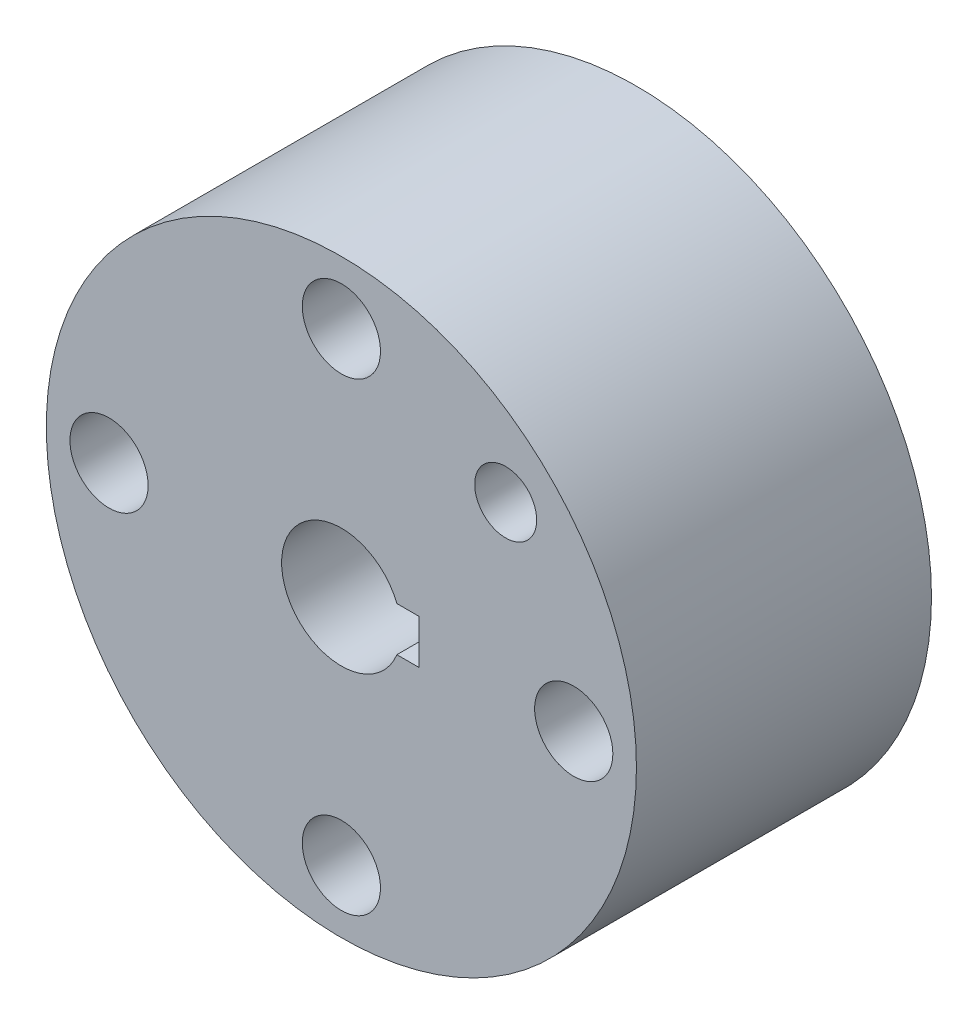
ISO-10303-21;
HEADER;
FILE_DESCRIPTION(('STEP AP214'),'2;1');
FILE_NAME('part.step','',(''),(''),'','','');
FILE_SCHEMA(('AUTOMOTIVE_DESIGN { 1 0 10303 214 1 1 1 1 }'));
ENDSEC;
DATA;
#1=APPLICATION_CONTEXT('core data for automotive mechanical design processes');
#2=APPLICATION_PROTOCOL_DEFINITION('international standard','automotive_design',2000,#1);
#3=PRODUCT_CONTEXT('',#1,'mechanical');
#4=PRODUCT('Part','Part','',(#3));
#5=PRODUCT_RELATED_PRODUCT_CATEGORY('part','',(#4));
#6=PRODUCT_DEFINITION_FORMATION('','',#4);
#7=PRODUCT_DEFINITION_CONTEXT('part definition',#1,'design');
#8=PRODUCT_DEFINITION('design','',#6,#7);
#9=PRODUCT_DEFINITION_SHAPE('','',#8);
#10=(LENGTH_UNIT() NAMED_UNIT(*) SI_UNIT(.MILLI.,.METRE.));
#11=(NAMED_UNIT(*) PLANE_ANGLE_UNIT() SI_UNIT($,.RADIAN.));
#12=(NAMED_UNIT(*) SI_UNIT($,.STERADIAN.) SOLID_ANGLE_UNIT());
#13=UNCERTAINTY_MEASURE_WITH_UNIT(LENGTH_MEASURE(1.E-05),#10,'distance_accuracy_value','');
#14=(GEOMETRIC_REPRESENTATION_CONTEXT(3) GLOBAL_UNCERTAINTY_ASSIGNED_CONTEXT((#13)) GLOBAL_UNIT_ASSIGNED_CONTEXT((#10,
#11,#12)) REPRESENTATION_CONTEXT('',''));
#15=CARTESIAN_POINT('',(0.,0.,0.));
#16=DIRECTION('',(0.,0.,1.));
#17=DIRECTION('',(1.,0.,0.));
#18=AXIS2_PLACEMENT_3D('',#15,#16,#17);
#19=CARTESIAN_POINT('',(0.,0.,20.));
#20=DIRECTION('',(0.,0.,-1.));
#21=DIRECTION('',(-1.,0.,0.));
#22=AXIS2_PLACEMENT_3D('',#19,#20,#21);
#23=CYLINDRICAL_SURFACE('',#22,4.05);
#24=CARTESIAN_POINT('',(0.,0.,8.));
#25=DIRECTION('',(0.,0.,1.));
#26=DIRECTION('',(1.,0.,0.));
#27=AXIS2_PLACEMENT_3D('',#24,#25,#26);
#28=CIRCLE('',#27,4.05);
#29=CARTESIAN_POINT('',(3.76198086119534,1.5,8.));
#30=VERTEX_POINT('',#29);
#31=CARTESIAN_POINT('',(3.76198086119534,-1.5,8.));
#32=VERTEX_POINT('',#31);
#33=EDGE_CURVE('E57',#30,#32,#28,.T.);
#34=ORIENTED_EDGE('',*,*,#33,.F.);
#35=DIRECTION('',(0.,0.,-1.));
#36=VECTOR('',#35,1.);
#37=CARTESIAN_POINT('',(3.76198086119534,1.5,20.));
#38=LINE('',#37,#36);
#39=CARTESIAN_POINT('',(3.76198086119534,1.5,20.));
#40=VERTEX_POINT('',#39);
#41=EDGE_CURVE('E51',#40,#30,#38,.T.);
#42=ORIENTED_EDGE('',*,*,#41,.F.);
#43=CARTESIAN_POINT('',(0.,0.,20.));
#44=DIRECTION('',(0.,0.,1.));
#45=DIRECTION('',(1.,0.,0.));
#46=AXIS2_PLACEMENT_3D('',#43,#44,#45);
#47=CIRCLE('',#46,4.05);
#48=CARTESIAN_POINT('',(3.76198086119534,-1.5,20.));
#49=VERTEX_POINT('',#48);
#50=EDGE_CURVE('E112',#40,#49,#47,.T.);
#51=ORIENTED_EDGE('',*,*,#50,.T.);
#52=DIRECTION('',(0.,0.,-1.));
#53=VECTOR('',#52,1.);
#54=CARTESIAN_POINT('',(3.76198086119534,-1.5,20.));
#55=LINE('',#54,#53);
#56=EDGE_CURVE('E64',#49,#32,#55,.T.);
#57=ORIENTED_EDGE('',*,*,#56,.T.);
#58=EDGE_LOOP('',(#34,#42,#51,#57));
#59=FACE_BOUND('',#58,.T.);
#60=ADVANCED_FACE('F43',(#59),#23,.F.);
#61=CARTESIAN_POINT('',(0.,1.5,20.));
#62=DIRECTION('',(0.,1.,0.));
#63=DIRECTION('',(0.,0.,1.));
#64=AXIS2_PLACEMENT_3D('',#61,#62,#63);
#65=PLANE('',#64);
#66=ORIENTED_EDGE('',*,*,#41,.T.);
#67=DIRECTION('',(1.,0.,0.));
#68=VECTOR('',#67,1.);
#69=CARTESIAN_POINT('',(0.,1.5,8.));
#70=LINE('',#69,#68);
#71=CARTESIAN_POINT('',(5.25,1.5,8.));
#72=VERTEX_POINT('',#71);
#73=EDGE_CURVE('E95',#30,#72,#70,.T.);
#74=ORIENTED_EDGE('',*,*,#73,.T.);
#75=DIRECTION('',(0.,0.,-1.));
#76=VECTOR('',#75,1.);
#77=CARTESIAN_POINT('',(5.25,1.5,20.));
#78=LINE('',#77,#76);
#79=CARTESIAN_POINT('',(5.25,1.5,20.));
#80=VERTEX_POINT('',#79);
#81=EDGE_CURVE('E94',#80,#72,#78,.T.);
#82=ORIENTED_EDGE('',*,*,#81,.F.);
#83=DIRECTION('',(1.,0.,0.));
#84=VECTOR('',#83,1.);
#85=CARTESIAN_POINT('',(0.,1.5,20.));
#86=LINE('',#85,#84);
#87=EDGE_CURVE('E109',#40,#80,#86,.T.);
#88=ORIENTED_EDGE('',*,*,#87,.F.);
#89=EDGE_LOOP('',(#66,#74,#82,#88));
#90=FACE_BOUND('',#89,.T.);
#91=ADVANCED_FACE('F108',(#90),#65,.F.);
#92=CARTESIAN_POINT('',(5.25,0.,20.));
#93=DIRECTION('',(-1.,0.,0.));
#94=DIRECTION('',(0.,0.,1.));
#95=AXIS2_PLACEMENT_3D('',#92,#93,#94);
#96=PLANE('',#95);
#97=DIRECTION('',(0.,1.,0.));
#98=VECTOR('',#97,1.);
#99=CARTESIAN_POINT('',(5.25,0.,8.));
#100=LINE('',#99,#98);
#101=CARTESIAN_POINT('',(5.25,-1.5,8.));
#102=VERTEX_POINT('',#101);
#103=EDGE_CURVE('E84',#102,#72,#100,.T.);
#104=ORIENTED_EDGE('',*,*,#103,.F.);
#105=DIRECTION('',(0.,0.,-1.));
#106=VECTOR('',#105,1.);
#107=CARTESIAN_POINT('',(5.25,-1.5,20.));
#108=LINE('',#107,#106);
#109=CARTESIAN_POINT('',(5.25,-1.5,20.));
#110=VERTEX_POINT('',#109);
#111=EDGE_CURVE('E91',#110,#102,#108,.T.);
#112=ORIENTED_EDGE('',*,*,#111,.F.);
#113=DIRECTION('',(0.,1.,0.));
#114=VECTOR('',#113,1.);
#115=CARTESIAN_POINT('',(5.25,0.,20.));
#116=LINE('',#115,#114);
#117=EDGE_CURVE('E141',#110,#80,#116,.T.);
#118=ORIENTED_EDGE('',*,*,#117,.T.);
#119=ORIENTED_EDGE('',*,*,#81,.T.);
#120=EDGE_LOOP('',(#104,#112,#118,#119));
#121=FACE_BOUND('',#120,.T.);
#122=ADVANCED_FACE('F89',(#121),#96,.T.);
#123=CARTESIAN_POINT('',(0.,0.,20.));
#124=DIRECTION('',(0.,0.,-1.));
#125=DIRECTION('',(-1.,0.,0.));
#126=AXIS2_PLACEMENT_3D('',#123,#124,#125);
#127=CYLINDRICAL_SURFACE('',#126,20.);
#128=CARTESIAN_POINT('',(0.,0.,20.));
#129=DIRECTION('',(0.,0.,1.));
#130=DIRECTION('',(1.,0.,0.));
#131=AXIS2_PLACEMENT_3D('',#128,#129,#130);
#132=CIRCLE('',#131,20.);
#133=CARTESIAN_POINT('',(20.,0.,20.));
#134=VERTEX_POINT('',#133);
#135=EDGE_CURVE('E136',#134,#134,#132,.T.);
#136=ORIENTED_EDGE('',*,*,#135,.F.);
#137=EDGE_LOOP('',(#136));
#138=FACE_BOUND('',#137,.T.);
#139=CARTESIAN_POINT('',(0.,0.,0.));
#140=DIRECTION('',(0.,0.,1.));
#141=DIRECTION('',(1.,0.,0.));
#142=AXIS2_PLACEMENT_3D('',#139,#140,#141);
#143=CIRCLE('',#142,20.);
#144=CARTESIAN_POINT('',(20.,0.,0.));
#145=VERTEX_POINT('',#144);
#146=EDGE_CURVE('E124',#145,#145,#143,.T.);
#147=ORIENTED_EDGE('',*,*,#146,.T.);
#148=EDGE_LOOP('',(#147));
#149=FACE_BOUND('',#148,.T.);
#150=ADVANCED_FACE('F157',(#138,#149),#127,.T.);
#151=CARTESIAN_POINT('',(0.,15.75,20.));
#152=DIRECTION('',(0.,0.,-1.));
#153=DIRECTION('',(-1.,0.,0.));
#154=AXIS2_PLACEMENT_3D('',#151,#152,#153);
#155=CYLINDRICAL_SURFACE('',#154,2.65);
#156=CARTESIAN_POINT('',(0.,15.75,20.));
#157=DIRECTION('',(0.,0.,1.));
#158=DIRECTION('',(1.,0.,0.));
#159=AXIS2_PLACEMENT_3D('',#156,#157,#158);
#160=CIRCLE('',#159,2.65);
#161=CARTESIAN_POINT('',(2.65,15.75,20.));
#162=VERTEX_POINT('',#161);
#163=EDGE_CURVE('E133',#162,#162,#160,.T.);
#164=ORIENTED_EDGE('',*,*,#163,.T.);
#165=EDGE_LOOP('',(#164));
#166=FACE_BOUND('',#165,.T.);
#167=CARTESIAN_POINT('',(0.,15.75,0.));
#168=DIRECTION('',(0.,0.,1.));
#169=DIRECTION('',(1.,0.,0.));
#170=AXIS2_PLACEMENT_3D('',#167,#168,#169);
#171=CIRCLE('',#170,2.65);
#172=CARTESIAN_POINT('',(2.65,15.75,0.));
#173=VERTEX_POINT('',#172);
#174=EDGE_CURVE('E152',#173,#173,#171,.T.);
#175=ORIENTED_EDGE('',*,*,#174,.F.);
#176=EDGE_LOOP('',(#175));
#177=FACE_BOUND('',#176,.T.);
#178=ADVANCED_FACE('F186',(#166,#177),#155,.F.);
#179=CARTESIAN_POINT('',(15.75,0.,20.));
#180=DIRECTION('',(0.,0.,-1.));
#181=DIRECTION('',(-1.,0.,0.));
#182=AXIS2_PLACEMENT_3D('',#179,#180,#181);
#183=CYLINDRICAL_SURFACE('',#182,2.65);
#184=CARTESIAN_POINT('',(15.75,0.,20.));
#185=DIRECTION('',(0.,0.,1.));
#186=DIRECTION('',(1.,0.,0.));
#187=AXIS2_PLACEMENT_3D('',#184,#185,#186);
#188=CIRCLE('',#187,2.65);
#189=CARTESIAN_POINT('',(18.4,0.,20.));
#190=VERTEX_POINT('',#189);
#191=EDGE_CURVE('E130',#190,#190,#188,.T.);
#192=ORIENTED_EDGE('',*,*,#191,.T.);
#193=EDGE_LOOP('',(#192));
#194=FACE_BOUND('',#193,.T.);
#195=CARTESIAN_POINT('',(15.75,0.,0.));
#196=DIRECTION('',(0.,0.,1.));
#197=DIRECTION('',(1.,0.,0.));
#198=AXIS2_PLACEMENT_3D('',#195,#196,#197);
#199=CIRCLE('',#198,2.65);
#200=CARTESIAN_POINT('',(18.4,0.,0.));
#201=VERTEX_POINT('',#200);
#202=EDGE_CURVE('E149',#201,#201,#199,.T.);
#203=ORIENTED_EDGE('',*,*,#202,.F.);
#204=EDGE_LOOP('',(#203));
#205=FACE_BOUND('',#204,.T.);
#206=ADVANCED_FACE('F190',(#194,#205),#183,.F.);
#207=CARTESIAN_POINT('',(-1.09981662173559E-13,-15.75,20.));
#208=DIRECTION('',(0.,0.,-1.));
#209=DIRECTION('',(-1.,0.,0.));
#210=AXIS2_PLACEMENT_3D('',#207,#208,#209);
#211=CYLINDRICAL_SURFACE('',#210,2.65);
#212=CARTESIAN_POINT('',(-1.09981662173559E-13,-15.75,20.));
#213=DIRECTION('',(0.,0.,1.));
#214=DIRECTION('',(1.,0.,0.));
#215=AXIS2_PLACEMENT_3D('',#212,#213,#214);
#216=CIRCLE('',#215,2.65);
#217=CARTESIAN_POINT('',(2.64999999999989,-15.75,20.));
#218=VERTEX_POINT('',#217);
#219=EDGE_CURVE('E127',#218,#218,#216,.T.);
#220=ORIENTED_EDGE('',*,*,#219,.T.);
#221=EDGE_LOOP('',(#220));
#222=FACE_BOUND('',#221,.T.);
#223=CARTESIAN_POINT('',(-1.09981662173559E-13,-15.75,0.));
#224=DIRECTION('',(0.,0.,1.));
#225=DIRECTION('',(1.,0.,0.));
#226=AXIS2_PLACEMENT_3D('',#223,#224,#225);
#227=CIRCLE('',#226,2.65);
#228=CARTESIAN_POINT('',(2.64999999999989,-15.75,0.));
#229=VERTEX_POINT('',#228);
#230=EDGE_CURVE('E146',#229,#229,#227,.T.);
#231=ORIENTED_EDGE('',*,*,#230,.F.);
#232=EDGE_LOOP('',(#231));
#233=FACE_BOUND('',#232,.T.);
#234=ADVANCED_FACE('F194',(#222,#233),#211,.F.);
#235=CARTESIAN_POINT('',(-15.75,1.64972493260338E-13,20.));
#236=DIRECTION('',(0.,0.,-1.));
#237=DIRECTION('',(-1.,0.,0.));
#238=AXIS2_PLACEMENT_3D('',#235,#236,#237);
#239=CYLINDRICAL_SURFACE('',#238,2.65);
#240=CARTESIAN_POINT('',(-15.75,1.64972493260338E-13,20.));
#241=DIRECTION('',(0.,0.,1.));
#242=DIRECTION('',(1.,0.,0.));
#243=AXIS2_PLACEMENT_3D('',#240,#241,#242);
#244=CIRCLE('',#243,2.65);
#245=CARTESIAN_POINT('',(-13.1,1.64972493260338E-13,20.));
#246=VERTEX_POINT('',#245);
#247=EDGE_CURVE('E123',#246,#246,#244,.T.);
#248=ORIENTED_EDGE('',*,*,#247,.T.);
#249=EDGE_LOOP('',(#248));
#250=FACE_BOUND('',#249,.T.);
#251=CARTESIAN_POINT('',(-15.75,1.64972493260338E-13,0.));
#252=DIRECTION('',(0.,0.,1.));
#253=DIRECTION('',(1.,0.,0.));
#254=AXIS2_PLACEMENT_3D('',#251,#252,#253);
#255=CIRCLE('',#254,2.65);
#256=CARTESIAN_POINT('',(-13.1,1.64972493260338E-13,0.));
#257=VERTEX_POINT('',#256);
#258=EDGE_CURVE('E116',#257,#257,#255,.T.);
#259=ORIENTED_EDGE('',*,*,#258,.F.);
#260=EDGE_LOOP('',(#259));
#261=FACE_BOUND('',#260,.T.);
#262=ADVANCED_FACE('F197',(#250,#261),#239,.F.);
#263=CARTESIAN_POINT('',(11.1369318036881,11.1369318036881,20.));
#264=DIRECTION('',(0.,0.,-1.));
#265=DIRECTION('',(-1.,0.,0.));
#266=AXIS2_PLACEMENT_3D('',#263,#264,#265);
#267=CYLINDRICAL_SURFACE('',#266,2.1);
#268=CARTESIAN_POINT('',(11.1369318036881,11.1369318036881,20.));
#269=DIRECTION('',(0.,0.,1.));
#270=DIRECTION('',(1.,0.,0.));
#271=AXIS2_PLACEMENT_3D('',#268,#269,#270);
#272=CIRCLE('',#271,2.1);
#273=CARTESIAN_POINT('',(13.2369318036881,11.1369318036881,20.));
#274=VERTEX_POINT('',#273);
#275=EDGE_CURVE('E120',#274,#274,#272,.T.);
#276=ORIENTED_EDGE('',*,*,#275,.T.);
#277=EDGE_LOOP('',(#276));
#278=FACE_BOUND('',#277,.T.);
#279=CARTESIAN_POINT('',(11.1369318036881,11.1369318036881,0.));
#280=DIRECTION('',(0.,0.,1.));
#281=DIRECTION('',(1.,0.,0.));
#282=AXIS2_PLACEMENT_3D('',#279,#280,#281);
#283=CIRCLE('',#282,2.1);
#284=CARTESIAN_POINT('',(13.2369318036881,11.1369318036881,0.));
#285=VERTEX_POINT('',#284);
#286=EDGE_CURVE('E113',#285,#285,#283,.T.);
#287=ORIENTED_EDGE('',*,*,#286,.F.);
#288=EDGE_LOOP('',(#287));
#289=FACE_BOUND('',#288,.T.);
#290=ADVANCED_FACE('F45',(#278,#289),#267,.F.);
#291=CARTESIAN_POINT('',(0.,-1.5,20.));
#292=DIRECTION('',(0.,1.,0.));
#293=DIRECTION('',(0.,0.,1.));
#294=AXIS2_PLACEMENT_3D('',#291,#292,#293);
#295=PLANE('',#294);
#296=DIRECTION('',(1.,0.,0.));
#297=VECTOR('',#296,1.);
#298=CARTESIAN_POINT('',(0.,-1.5,8.));
#299=LINE('',#298,#297);
#300=EDGE_CURVE('E12',#32,#102,#299,.T.);
#301=ORIENTED_EDGE('',*,*,#300,.F.);
#302=ORIENTED_EDGE('',*,*,#56,.F.);
#303=DIRECTION('',(1.,0.,0.));
#304=VECTOR('',#303,1.);
#305=CARTESIAN_POINT('',(0.,-1.5,20.));
#306=LINE('',#305,#304);
#307=EDGE_CURVE('E100',#49,#110,#306,.T.);
#308=ORIENTED_EDGE('',*,*,#307,.T.);
#309=ORIENTED_EDGE('',*,*,#111,.T.);
#310=EDGE_LOOP('',(#301,#302,#308,#309));
#311=FACE_BOUND('',#310,.T.);
#312=ADVANCED_FACE('F98',(#311),#295,.T.);
#313=CARTESIAN_POINT('',(0.,0.,20.));
#314=DIRECTION('',(0.,0.,1.));
#315=DIRECTION('',(1.,0.,0.));
#316=AXIS2_PLACEMENT_3D('',#313,#314,#315);
#317=PLANE('',#316);
#318=ORIENTED_EDGE('',*,*,#275,.F.);
#319=EDGE_LOOP('',(#318));
#320=FACE_BOUND('',#319,.T.);
#321=ORIENTED_EDGE('',*,*,#247,.F.);
#322=EDGE_LOOP('',(#321));
#323=FACE_BOUND('',#322,.T.);
#324=ORIENTED_EDGE('',*,*,#219,.F.);
#325=EDGE_LOOP('',(#324));
#326=FACE_BOUND('',#325,.T.);
#327=ORIENTED_EDGE('',*,*,#191,.F.);
#328=EDGE_LOOP('',(#327));
#329=FACE_BOUND('',#328,.T.);
#330=ORIENTED_EDGE('',*,*,#163,.F.);
#331=EDGE_LOOP('',(#330));
#332=FACE_BOUND('',#331,.T.);
#333=ORIENTED_EDGE('',*,*,#135,.T.);
#334=EDGE_LOOP('',(#333));
#335=FACE_BOUND('',#334,.T.);
#336=ORIENTED_EDGE('',*,*,#50,.F.);
#337=ORIENTED_EDGE('',*,*,#87,.T.);
#338=ORIENTED_EDGE('',*,*,#117,.F.);
#339=ORIENTED_EDGE('',*,*,#307,.F.);
#340=EDGE_LOOP('',(#336,#337,#338,#339));
#341=FACE_BOUND('',#340,.T.);
#342=ADVANCED_FACE('F161',(#320,#323,#326,#329,#332,#335,#341),#317,.T.);
#343=CARTESIAN_POINT('',(0.,0.,0.));
#344=DIRECTION('',(0.,0.,1.));
#345=DIRECTION('',(1.,0.,0.));
#346=AXIS2_PLACEMENT_3D('',#343,#344,#345);
#347=PLANE('',#346);
#348=CARTESIAN_POINT('',(0.,0.,0.));
#349=DIRECTION('',(0.,0.,-1.));
#350=DIRECTION('',(-1.,0.,0.));
#351=AXIS2_PLACEMENT_3D('',#348,#349,#350);
#352=CIRCLE('',#351,10.);
#353=CARTESIAN_POINT('',(-10.,0.,0.));
#354=VERTEX_POINT('',#353);
#355=EDGE_CURVE('E312',#354,#354,#352,.T.);
#356=ORIENTED_EDGE('',*,*,#355,.F.);
#357=EDGE_LOOP('',(#356));
#358=FACE_BOUND('',#357,.T.);
#359=ORIENTED_EDGE('',*,*,#286,.T.);
#360=EDGE_LOOP('',(#359));
#361=FACE_BOUND('',#360,.T.);
#362=ORIENTED_EDGE('',*,*,#258,.T.);
#363=EDGE_LOOP('',(#362));
#364=FACE_BOUND('',#363,.T.);
#365=ORIENTED_EDGE('',*,*,#230,.T.);
#366=EDGE_LOOP('',(#365));
#367=FACE_BOUND('',#366,.T.);
#368=ORIENTED_EDGE('',*,*,#202,.T.);
#369=EDGE_LOOP('',(#368));
#370=FACE_BOUND('',#369,.T.);
#371=ORIENTED_EDGE('',*,*,#174,.T.);
#372=EDGE_LOOP('',(#371));
#373=FACE_BOUND('',#372,.T.);
#374=ORIENTED_EDGE('',*,*,#146,.F.);
#375=EDGE_LOOP('',(#374));
#376=FACE_BOUND('',#375,.T.);
#377=ADVANCED_FACE('F159',(#358,#361,#364,#367,#370,#373,#376),#347,.F.);
#378=CARTESIAN_POINT('',(0.,0.,8.));
#379=DIRECTION('',(0.,0.,1.));
#380=DIRECTION('',(1.,0.,0.));
#381=AXIS2_PLACEMENT_3D('',#378,#379,#380);
#382=PLANE('',#381);
#383=ORIENTED_EDGE('',*,*,#33,.T.);
#384=ORIENTED_EDGE('',*,*,#300,.T.);
#385=ORIENTED_EDGE('',*,*,#103,.T.);
#386=ORIENTED_EDGE('',*,*,#73,.F.);
#387=EDGE_LOOP('',(#383,#384,#385,#386));
#388=FACE_BOUND('',#387,.T.);
#389=CARTESIAN_POINT('',(0.,0.,8.));
#390=DIRECTION('',(0.,0.,1.));
#391=DIRECTION('',(1.,0.,0.));
#392=AXIS2_PLACEMENT_3D('',#389,#390,#391);
#393=CIRCLE('',#392,10.);
#394=CARTESIAN_POINT('',(10.,0.,8.));
#395=VERTEX_POINT('',#394);
#396=EDGE_CURVE('E96',#395,#395,#393,.F.);
#397=ORIENTED_EDGE('',*,*,#396,.T.);
#398=EDGE_LOOP('',(#397));
#399=FACE_BOUND('',#398,.T.);
#400=ADVANCED_FACE('F82',(#388,#399),#382,.F.);
#401=CARTESIAN_POINT('',(0.,0.,48.2842712474619));
#402=DIRECTION('',(0.,0.,-1.));
#403=DIRECTION('',(-1.,0.,0.));
#404=AXIS2_PLACEMENT_3D('',#401,#402,#403);
#405=CYLINDRICAL_SURFACE('',#404,10.);
#406=ORIENTED_EDGE('',*,*,#355,.T.);
#407=EDGE_LOOP('',(#406));
#408=FACE_BOUND('',#407,.T.);
#409=ORIENTED_EDGE('',*,*,#396,.F.);
#410=EDGE_LOOP('',(#409));
#411=FACE_BOUND('',#410,.T.);
#412=ADVANCED_FACE('F168',(#408,#411),#405,.F.);
#413=CLOSED_SHELL('',(#60,#91,#122,#150,#178,#206,#234,#262,#290,#312,#342,#377,#400,#412));
#414=MANIFOLD_SOLID_BREP('B2',#413);
#415=ADVANCED_BREP_SHAPE_REPRESENTATION('',(#18,#414),#14);
#416=SHAPE_DEFINITION_REPRESENTATION(#9,#415);
ENDSEC;
END-ISO-10303-21;
